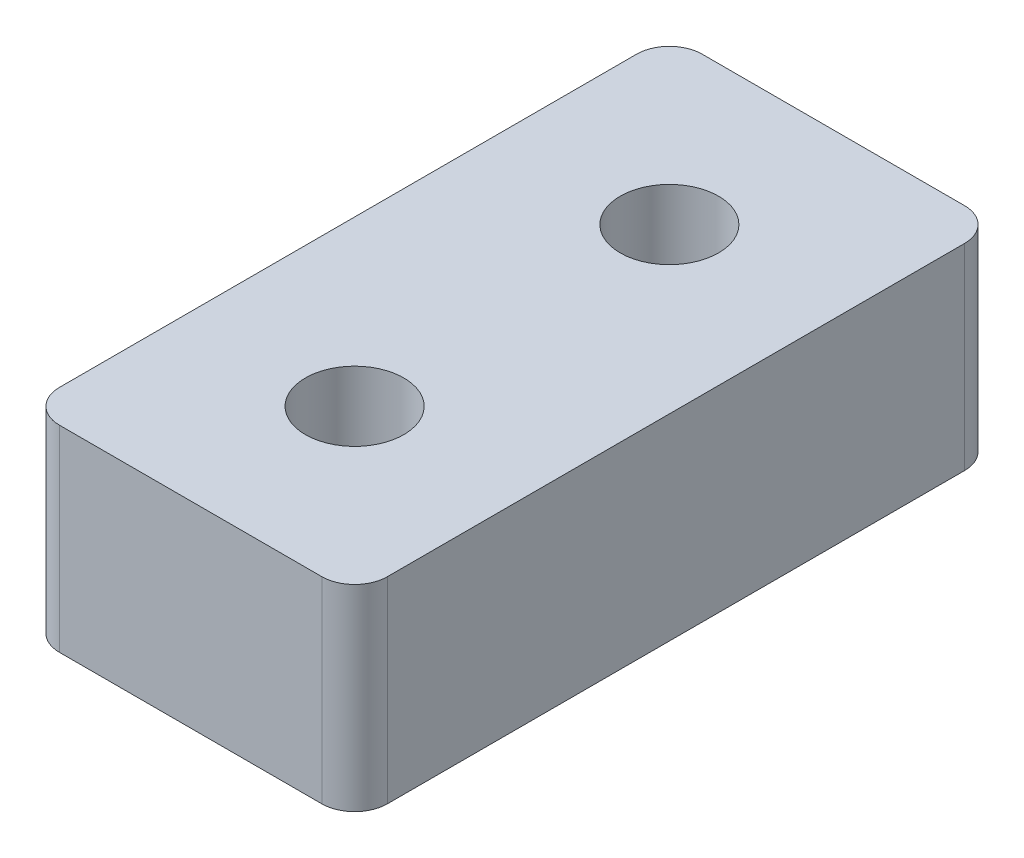
ISO-10303-21;
HEADER;
FILE_DESCRIPTION(('STEP AP214'),'2;1');
FILE_NAME('part.step','',(''),(''),'','','');
FILE_SCHEMA(('AUTOMOTIVE_DESIGN { 1 0 10303 214 1 1 1 1 }'));
ENDSEC;
DATA;
#1=APPLICATION_CONTEXT('core data for automotive mechanical design processes');
#2=APPLICATION_PROTOCOL_DEFINITION('international standard','automotive_design',2000,#1);
#3=PRODUCT_CONTEXT('',#1,'mechanical');
#4=PRODUCT('Part','Part','',(#3));
#5=PRODUCT_RELATED_PRODUCT_CATEGORY('part','',(#4));
#6=PRODUCT_DEFINITION_FORMATION('','',#4);
#7=PRODUCT_DEFINITION_CONTEXT('part definition',#1,'design');
#8=PRODUCT_DEFINITION('design','',#6,#7);
#9=PRODUCT_DEFINITION_SHAPE('','',#8);
#10=(LENGTH_UNIT() NAMED_UNIT(*) SI_UNIT(.MILLI.,.METRE.));
#11=(NAMED_UNIT(*) PLANE_ANGLE_UNIT() SI_UNIT($,.RADIAN.));
#12=(NAMED_UNIT(*) SI_UNIT($,.STERADIAN.) SOLID_ANGLE_UNIT());
#13=UNCERTAINTY_MEASURE_WITH_UNIT(LENGTH_MEASURE(1.E-05),#10,'distance_accuracy_value','');
#14=(GEOMETRIC_REPRESENTATION_CONTEXT(3) GLOBAL_UNCERTAINTY_ASSIGNED_CONTEXT((#13)) GLOBAL_UNIT_ASSIGNED_CONTEXT((#10,
#11,#12)) REPRESENTATION_CONTEXT('',''));
#15=CARTESIAN_POINT('',(0.,0.,0.));
#16=DIRECTION('',(0.,0.,1.));
#17=DIRECTION('',(1.,0.,0.));
#18=AXIS2_PLACEMENT_3D('',#15,#16,#17);
#19=CARTESIAN_POINT('',(0.,6.,0.));
#20=DIRECTION('',(0.,-1.,0.));
#21=DIRECTION('',(0.,0.,-1.));
#22=AXIS2_PLACEMENT_3D('',#19,#20,#21);
#23=PLANE('',#22);
#24=DIRECTION('',(0.,0.,-1.));
#25=VECTOR('',#24,1.);
#26=CARTESIAN_POINT('',(10.,6.,0.));
#27=LINE('',#26,#25);
#28=CARTESIAN_POINT('',(10.,6.,-1.));
#29=VERTEX_POINT('',#28);
#30=CARTESIAN_POINT('',(10.,6.,-18.6));
#31=VERTEX_POINT('',#30);
#32=EDGE_CURVE('E173',#29,#31,#27,.T.);
#33=ORIENTED_EDGE('',*,*,#32,.T.);
#34=CARTESIAN_POINT('',(9.,6.,-18.6));
#35=DIRECTION('',(0.,-1.,0.));
#36=DIRECTION('',(0.,0.,-1.));
#37=AXIS2_PLACEMENT_3D('',#34,#35,#36);
#38=CIRCLE('',#37,1.);
#39=CARTESIAN_POINT('',(9.,6.,-19.6));
#40=VERTEX_POINT('',#39);
#41=EDGE_CURVE('E150',#31,#40,#38,.F.);
#42=ORIENTED_EDGE('',*,*,#41,.T.);
#43=DIRECTION('',(-1.,0.,0.));
#44=VECTOR('',#43,1.);
#45=CARTESIAN_POINT('',(0.,6.,-19.6));
#46=LINE('',#45,#44);
#47=CARTESIAN_POINT('',(1.,6.,-19.6));
#48=VERTEX_POINT('',#47);
#49=EDGE_CURVE('E121',#40,#48,#46,.T.);
#50=ORIENTED_EDGE('',*,*,#49,.T.);
#51=CARTESIAN_POINT('',(0.999999999999999,6.,-18.6));
#52=DIRECTION('',(0.,-1.,0.));
#53=DIRECTION('',(0.,0.,-1.));
#54=AXIS2_PLACEMENT_3D('',#51,#52,#53);
#55=CIRCLE('',#54,1.);
#56=CARTESIAN_POINT('',(0.,6.,-18.6));
#57=VERTEX_POINT('',#56);
#58=EDGE_CURVE('E145',#48,#57,#55,.F.);
#59=ORIENTED_EDGE('',*,*,#58,.T.);
#60=DIRECTION('',(0.,0.,1.));
#61=VECTOR('',#60,1.);
#62=CARTESIAN_POINT('',(0.,6.,0.));
#63=LINE('',#62,#61);
#64=CARTESIAN_POINT('',(0.,6.,-1.));
#65=VERTEX_POINT('',#64);
#66=EDGE_CURVE('E128',#57,#65,#63,.T.);
#67=ORIENTED_EDGE('',*,*,#66,.T.);
#68=CARTESIAN_POINT('',(1.,6.,-1.));
#69=DIRECTION('',(0.,-1.,0.));
#70=DIRECTION('',(0.,0.,-1.));
#71=AXIS2_PLACEMENT_3D('',#68,#69,#70);
#72=CIRCLE('',#71,1.);
#73=CARTESIAN_POINT('',(1.,6.,0.));
#74=VERTEX_POINT('',#73);
#75=EDGE_CURVE('E57',#65,#74,#72,.F.);
#76=ORIENTED_EDGE('',*,*,#75,.T.);
#77=DIRECTION('',(1.,0.,0.));
#78=VECTOR('',#77,1.);
#79=CARTESIAN_POINT('',(0.,6.,0.));
#80=LINE('',#79,#78);
#81=CARTESIAN_POINT('',(9.,6.,0.));
#82=VERTEX_POINT('',#81);
#83=EDGE_CURVE('E131',#74,#82,#80,.T.);
#84=ORIENTED_EDGE('',*,*,#83,.T.);
#85=CARTESIAN_POINT('',(9.,6.,-1.));
#86=DIRECTION('',(0.,-1.,0.));
#87=DIRECTION('',(0.,0.,-1.));
#88=AXIS2_PLACEMENT_3D('',#85,#86,#87);
#89=CIRCLE('',#88,1.);
#90=EDGE_CURVE('E148',#82,#29,#89,.F.);
#91=ORIENTED_EDGE('',*,*,#90,.T.);
#92=EDGE_LOOP('',(#33,#42,#50,#59,#67,#76,#84,#91));
#93=FACE_BOUND('',#92,.T.);
#94=CARTESIAN_POINT('',(5.,6.,-14.6));
#95=DIRECTION('',(0.,1.,0.));
#96=DIRECTION('',(0.,0.,1.));
#97=AXIS2_PLACEMENT_3D('',#94,#95,#96);
#98=CIRCLE('',#97,1.5);
#99=CARTESIAN_POINT('',(5.,6.,-13.1));
#100=VERTEX_POINT('',#99);
#101=EDGE_CURVE('E166',#100,#100,#98,.T.);
#102=ORIENTED_EDGE('',*,*,#101,.F.);
#103=EDGE_LOOP('',(#102));
#104=FACE_BOUND('',#103,.T.);
#105=CARTESIAN_POINT('',(5.,6.,-5.));
#106=DIRECTION('',(0.,1.,0.));
#107=DIRECTION('',(0.,0.,1.));
#108=AXIS2_PLACEMENT_3D('',#105,#106,#107);
#109=CIRCLE('',#108,1.5);
#110=CARTESIAN_POINT('',(5.,6.,-3.5));
#111=VERTEX_POINT('',#110);
#112=EDGE_CURVE('E178',#111,#111,#109,.T.);
#113=ORIENTED_EDGE('',*,*,#112,.F.);
#114=EDGE_LOOP('',(#113));
#115=FACE_BOUND('',#114,.T.);
#116=ADVANCED_FACE('F35',(#93,#104,#115),#23,.F.);
#117=CARTESIAN_POINT('',(0.,0.,0.));
#118=DIRECTION('',(0.,-1.,0.));
#119=DIRECTION('',(0.,0.,-1.));
#120=AXIS2_PLACEMENT_3D('',#117,#118,#119);
#121=PLANE('',#120);
#122=CARTESIAN_POINT('',(5.,0.,-14.6));
#123=DIRECTION('',(0.,1.,0.));
#124=DIRECTION('',(0.,0.,1.));
#125=AXIS2_PLACEMENT_3D('',#122,#123,#124);
#126=CIRCLE('',#125,1.5);
#127=CARTESIAN_POINT('',(5.,0.,-13.1));
#128=VERTEX_POINT('',#127);
#129=EDGE_CURVE('E169',#128,#128,#126,.T.);
#130=ORIENTED_EDGE('',*,*,#129,.T.);
#131=EDGE_LOOP('',(#130));
#132=FACE_BOUND('',#131,.T.);
#133=DIRECTION('',(-1.,0.,0.));
#134=VECTOR('',#133,1.);
#135=CARTESIAN_POINT('',(0.,0.,-19.6));
#136=LINE('',#135,#134);
#137=CARTESIAN_POINT('',(9.,0.,-19.6));
#138=VERTEX_POINT('',#137);
#139=CARTESIAN_POINT('',(1.,0.,-19.6));
#140=VERTEX_POINT('',#139);
#141=EDGE_CURVE('E118',#138,#140,#136,.T.);
#142=ORIENTED_EDGE('',*,*,#141,.F.);
#143=CARTESIAN_POINT('',(9.,0.,-18.6));
#144=DIRECTION('',(0.,-1.,0.));
#145=DIRECTION('',(0.,0.,-1.));
#146=AXIS2_PLACEMENT_3D('',#143,#144,#145);
#147=CIRCLE('',#146,1.);
#148=CARTESIAN_POINT('',(10.,0.,-18.6));
#149=VERTEX_POINT('',#148);
#150=EDGE_CURVE('E101',#138,#149,#147,.T.);
#151=ORIENTED_EDGE('',*,*,#150,.T.);
#152=DIRECTION('',(0.,0.,-1.));
#153=VECTOR('',#152,1.);
#154=CARTESIAN_POINT('',(10.,0.,0.));
#155=LINE('',#154,#153);
#156=CARTESIAN_POINT('',(10.,0.,-1.));
#157=VERTEX_POINT('',#156);
#158=EDGE_CURVE('E129',#157,#149,#155,.T.);
#159=ORIENTED_EDGE('',*,*,#158,.F.);
#160=CARTESIAN_POINT('',(9.,0.,-1.));
#161=DIRECTION('',(0.,-1.,0.));
#162=DIRECTION('',(0.,0.,-1.));
#163=AXIS2_PLACEMENT_3D('',#160,#161,#162);
#164=CIRCLE('',#163,1.);
#165=CARTESIAN_POINT('',(9.,0.,0.));
#166=VERTEX_POINT('',#165);
#167=EDGE_CURVE('E112',#157,#166,#164,.T.);
#168=ORIENTED_EDGE('',*,*,#167,.T.);
#169=DIRECTION('',(1.,0.,0.));
#170=VECTOR('',#169,1.);
#171=CARTESIAN_POINT('',(0.,0.,0.));
#172=LINE('',#171,#170);
#173=CARTESIAN_POINT('',(1.,0.,0.));
#174=VERTEX_POINT('',#173);
#175=EDGE_CURVE('E133',#174,#166,#172,.T.);
#176=ORIENTED_EDGE('',*,*,#175,.F.);
#177=CARTESIAN_POINT('',(1.,0.,-1.));
#178=DIRECTION('',(0.,-1.,0.));
#179=DIRECTION('',(0.,0.,-1.));
#180=AXIS2_PLACEMENT_3D('',#177,#178,#179);
#181=CIRCLE('',#180,1.);
#182=CARTESIAN_POINT('',(0.,0.,-1.));
#183=VERTEX_POINT('',#182);
#184=EDGE_CURVE('E139',#174,#183,#181,.T.);
#185=ORIENTED_EDGE('',*,*,#184,.T.);
#186=DIRECTION('',(0.,0.,1.));
#187=VECTOR('',#186,1.);
#188=CARTESIAN_POINT('',(0.,0.,0.));
#189=LINE('',#188,#187);
#190=CARTESIAN_POINT('',(0.,0.,-18.6));
#191=VERTEX_POINT('',#190);
#192=EDGE_CURVE('E161',#191,#183,#189,.T.);
#193=ORIENTED_EDGE('',*,*,#192,.F.);
#194=CARTESIAN_POINT('',(0.999999999999999,0.,-18.6));
#195=DIRECTION('',(0.,-1.,0.));
#196=DIRECTION('',(0.,0.,-1.));
#197=AXIS2_PLACEMENT_3D('',#194,#195,#196);
#198=CIRCLE('',#197,1.);
#199=EDGE_CURVE('E122',#191,#140,#198,.T.);
#200=ORIENTED_EDGE('',*,*,#199,.T.);
#201=EDGE_LOOP('',(#142,#151,#159,#168,#176,#185,#193,#200));
#202=FACE_BOUND('',#201,.T.);
#203=CARTESIAN_POINT('',(5.,0.,-5.));
#204=DIRECTION('',(0.,1.,0.));
#205=DIRECTION('',(0.,0.,1.));
#206=AXIS2_PLACEMENT_3D('',#203,#204,#205);
#207=CIRCLE('',#206,1.5);
#208=CARTESIAN_POINT('',(5.,0.,-3.5));
#209=VERTEX_POINT('',#208);
#210=EDGE_CURVE('E180',#209,#209,#207,.T.);
#211=ORIENTED_EDGE('',*,*,#210,.T.);
#212=EDGE_LOOP('',(#211));
#213=FACE_BOUND('',#212,.T.);
#214=ADVANCED_FACE('F125',(#132,#202,#213),#121,.T.);
#215=CARTESIAN_POINT('',(0.,6.,0.));
#216=DIRECTION('',(1.,0.,0.));
#217=DIRECTION('',(0.,0.,-1.));
#218=AXIS2_PLACEMENT_3D('',#215,#216,#217);
#219=PLANE('',#218);
#220=ORIENTED_EDGE('',*,*,#192,.T.);
#221=DIRECTION('',(0.,-1.,0.));
#222=VECTOR('',#221,1.);
#223=CARTESIAN_POINT('',(0.,6.,-1.));
#224=LINE('',#223,#222);
#225=EDGE_CURVE('E11',#183,#65,#224,.F.);
#226=ORIENTED_EDGE('',*,*,#225,.T.);
#227=ORIENTED_EDGE('',*,*,#66,.F.);
#228=DIRECTION('',(0.,-1.,0.));
#229=VECTOR('',#228,1.);
#230=CARTESIAN_POINT('',(0.,6.,-18.6));
#231=LINE('',#230,#229);
#232=EDGE_CURVE('E43',#57,#191,#231,.T.);
#233=ORIENTED_EDGE('',*,*,#232,.T.);
#234=EDGE_LOOP('',(#220,#226,#227,#233));
#235=FACE_BOUND('',#234,.T.);
#236=ADVANCED_FACE('F160',(#235),#219,.F.);
#237=CARTESIAN_POINT('',(0.,6.,0.));
#238=DIRECTION('',(0.,0.,-1.));
#239=DIRECTION('',(-1.,0.,0.));
#240=AXIS2_PLACEMENT_3D('',#237,#238,#239);
#241=PLANE('',#240);
#242=ORIENTED_EDGE('',*,*,#175,.T.);
#243=DIRECTION('',(0.,-1.,0.));
#244=VECTOR('',#243,1.);
#245=CARTESIAN_POINT('',(9.,6.,0.));
#246=LINE('',#245,#244);
#247=EDGE_CURVE('E50',#166,#82,#246,.F.);
#248=ORIENTED_EDGE('',*,*,#247,.T.);
#249=ORIENTED_EDGE('',*,*,#83,.F.);
#250=DIRECTION('',(0.,-1.,0.));
#251=VECTOR('',#250,1.);
#252=CARTESIAN_POINT('',(1.,6.,0.));
#253=LINE('',#252,#251);
#254=EDGE_CURVE('E152',#74,#174,#253,.T.);
#255=ORIENTED_EDGE('',*,*,#254,.T.);
#256=EDGE_LOOP('',(#242,#248,#249,#255));
#257=FACE_BOUND('',#256,.T.);
#258=ADVANCED_FACE('F206',(#257),#241,.F.);
#259=CARTESIAN_POINT('',(10.,6.,0.));
#260=DIRECTION('',(-1.,0.,0.));
#261=DIRECTION('',(0.,0.,1.));
#262=AXIS2_PLACEMENT_3D('',#259,#260,#261);
#263=PLANE('',#262);
#264=ORIENTED_EDGE('',*,*,#158,.T.);
#265=DIRECTION('',(0.,-1.,0.));
#266=VECTOR('',#265,1.);
#267=CARTESIAN_POINT('',(10.,6.,-18.6));
#268=LINE('',#267,#266);
#269=EDGE_CURVE('E106',#149,#31,#268,.F.);
#270=ORIENTED_EDGE('',*,*,#269,.T.);
#271=ORIENTED_EDGE('',*,*,#32,.F.);
#272=DIRECTION('',(0.,-1.,0.));
#273=VECTOR('',#272,1.);
#274=CARTESIAN_POINT('',(10.,6.,-1.));
#275=LINE('',#274,#273);
#276=EDGE_CURVE('E111',#29,#157,#275,.T.);
#277=ORIENTED_EDGE('',*,*,#276,.T.);
#278=EDGE_LOOP('',(#264,#270,#271,#277));
#279=FACE_BOUND('',#278,.T.);
#280=ADVANCED_FACE('F203',(#279),#263,.F.);
#281=CARTESIAN_POINT('',(0.,6.,-19.6));
#282=DIRECTION('',(0.,0.,1.));
#283=DIRECTION('',(1.,0.,0.));
#284=AXIS2_PLACEMENT_3D('',#281,#282,#283);
#285=PLANE('',#284);
#286=ORIENTED_EDGE('',*,*,#49,.F.);
#287=DIRECTION('',(0.,-1.,0.));
#288=VECTOR('',#287,1.);
#289=CARTESIAN_POINT('',(9.,6.,-19.6));
#290=LINE('',#289,#288);
#291=EDGE_CURVE('E105',#40,#138,#290,.T.);
#292=ORIENTED_EDGE('',*,*,#291,.T.);
#293=ORIENTED_EDGE('',*,*,#141,.T.);
#294=DIRECTION('',(0.,-1.,0.));
#295=VECTOR('',#294,1.);
#296=CARTESIAN_POINT('',(1.,6.,-19.6));
#297=LINE('',#296,#295);
#298=EDGE_CURVE('E123',#140,#48,#297,.F.);
#299=ORIENTED_EDGE('',*,*,#298,.T.);
#300=EDGE_LOOP('',(#286,#292,#293,#299));
#301=FACE_BOUND('',#300,.T.);
#302=ADVANCED_FACE('F117',(#301),#285,.F.);
#303=CARTESIAN_POINT('',(5.,6.,-14.6));
#304=DIRECTION('',(0.,-1.,0.));
#305=DIRECTION('',(0.,0.,-1.));
#306=AXIS2_PLACEMENT_3D('',#303,#304,#305);
#307=CYLINDRICAL_SURFACE('',#306,1.5);
#308=ORIENTED_EDGE('',*,*,#101,.T.);
#309=EDGE_LOOP('',(#308));
#310=FACE_BOUND('',#309,.T.);
#311=ORIENTED_EDGE('',*,*,#129,.F.);
#312=EDGE_LOOP('',(#311));
#313=FACE_BOUND('',#312,.T.);
#314=ADVANCED_FACE('F198',(#310,#313),#307,.F.);
#315=CARTESIAN_POINT('',(5.,6.,-5.));
#316=DIRECTION('',(0.,-1.,0.));
#317=DIRECTION('',(0.,0.,-1.));
#318=AXIS2_PLACEMENT_3D('',#315,#316,#317);
#319=CYLINDRICAL_SURFACE('',#318,1.5);
#320=ORIENTED_EDGE('',*,*,#112,.T.);
#321=EDGE_LOOP('',(#320));
#322=FACE_BOUND('',#321,.T.);
#323=ORIENTED_EDGE('',*,*,#210,.F.);
#324=EDGE_LOOP('',(#323));
#325=FACE_BOUND('',#324,.T.);
#326=ADVANCED_FACE('F186',(#322,#325),#319,.F.);
#327=CARTESIAN_POINT('',(9.,6.,-18.6));
#328=DIRECTION('',(0.,-1.,0.));
#329=DIRECTION('',(0.,0.,-1.));
#330=AXIS2_PLACEMENT_3D('',#327,#328,#329);
#331=CYLINDRICAL_SURFACE('',#330,1.);
#332=ORIENTED_EDGE('',*,*,#41,.F.);
#333=ORIENTED_EDGE('',*,*,#269,.F.);
#334=ORIENTED_EDGE('',*,*,#150,.F.);
#335=ORIENTED_EDGE('',*,*,#291,.F.);
#336=EDGE_LOOP('',(#332,#333,#334,#335));
#337=FACE_BOUND('',#336,.T.);
#338=ADVANCED_FACE('F104',(#337),#331,.T.);
#339=CARTESIAN_POINT('',(9.,6.,-1.));
#340=DIRECTION('',(0.,-1.,0.));
#341=DIRECTION('',(0.,0.,-1.));
#342=AXIS2_PLACEMENT_3D('',#339,#340,#341);
#343=CYLINDRICAL_SURFACE('',#342,1.);
#344=ORIENTED_EDGE('',*,*,#90,.F.);
#345=ORIENTED_EDGE('',*,*,#247,.F.);
#346=ORIENTED_EDGE('',*,*,#167,.F.);
#347=ORIENTED_EDGE('',*,*,#276,.F.);
#348=EDGE_LOOP('',(#344,#345,#346,#347));
#349=FACE_BOUND('',#348,.T.);
#350=ADVANCED_FACE('F214',(#349),#343,.T.);
#351=CARTESIAN_POINT('',(1.,6.,-1.));
#352=DIRECTION('',(0.,-1.,0.));
#353=DIRECTION('',(0.,0.,-1.));
#354=AXIS2_PLACEMENT_3D('',#351,#352,#353);
#355=CYLINDRICAL_SURFACE('',#354,1.);
#356=ORIENTED_EDGE('',*,*,#75,.F.);
#357=ORIENTED_EDGE('',*,*,#225,.F.);
#358=ORIENTED_EDGE('',*,*,#184,.F.);
#359=ORIENTED_EDGE('',*,*,#254,.F.);
#360=EDGE_LOOP('',(#356,#357,#358,#359));
#361=FACE_BOUND('',#360,.T.);
#362=ADVANCED_FACE('F216',(#361),#355,.T.);
#363=CARTESIAN_POINT('',(0.999999999999999,6.,-18.6));
#364=DIRECTION('',(0.,-1.,0.));
#365=DIRECTION('',(0.,0.,-1.));
#366=AXIS2_PLACEMENT_3D('',#363,#364,#365);
#367=CYLINDRICAL_SURFACE('',#366,1.);
#368=ORIENTED_EDGE('',*,*,#58,.F.);
#369=ORIENTED_EDGE('',*,*,#298,.F.);
#370=ORIENTED_EDGE('',*,*,#199,.F.);
#371=ORIENTED_EDGE('',*,*,#232,.F.);
#372=EDGE_LOOP('',(#368,#369,#370,#371));
#373=FACE_BOUND('',#372,.T.);
#374=ADVANCED_FACE('F37',(#373),#367,.T.);
#375=CLOSED_SHELL('',(#116,#214,#236,#258,#280,#302,#314,#326,#338,#350,#362,#374));
#376=MANIFOLD_SOLID_BREP('B2',#375);
#377=ADVANCED_BREP_SHAPE_REPRESENTATION('',(#18,#376),#14);
#378=SHAPE_DEFINITION_REPRESENTATION(#9,#377);
ENDSEC;
END-ISO-10303-21;
